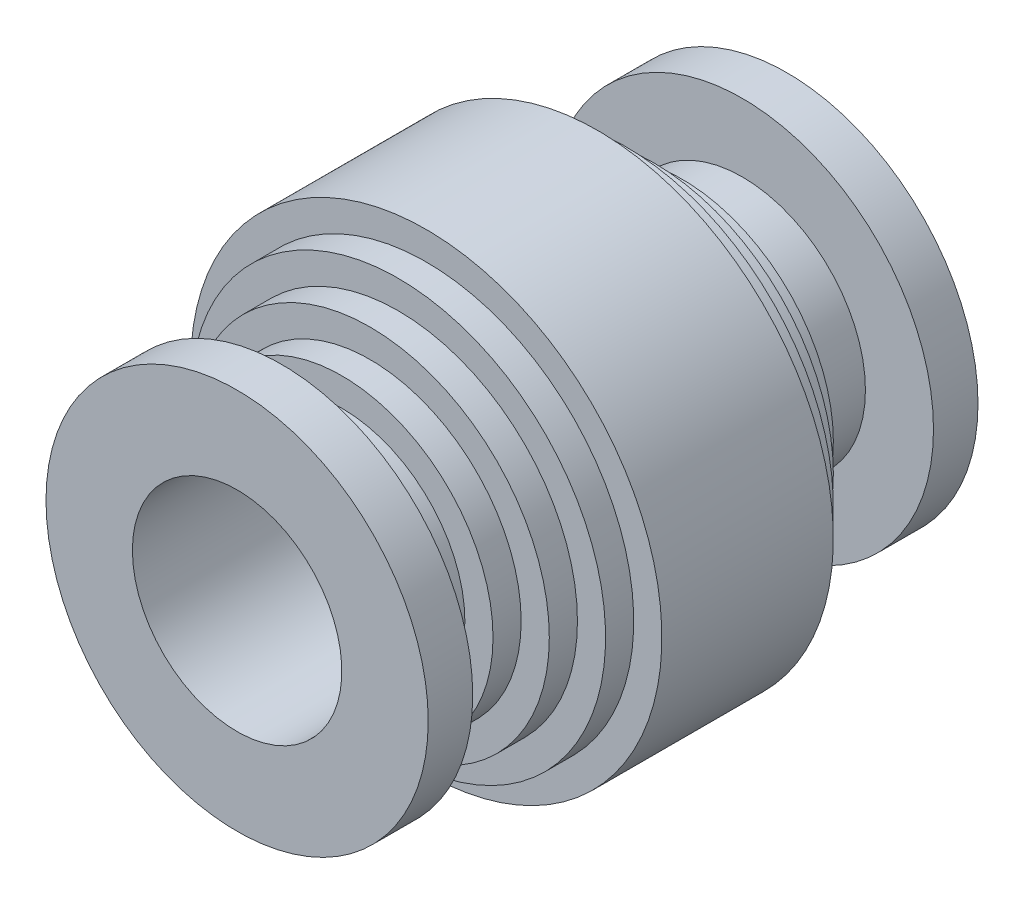
ISO-10303-21;
HEADER;
FILE_DESCRIPTION(('STEP AP214'),'2;1');
FILE_NAME('part.step','',(''),(''),'','','');
FILE_SCHEMA(('AUTOMOTIVE_DESIGN { 1 0 10303 214 1 1 1 1 }'));
ENDSEC;
DATA;
#1=APPLICATION_CONTEXT('core data for automotive mechanical design processes');
#2=APPLICATION_PROTOCOL_DEFINITION('international standard','automotive_design',2000,#1);
#3=PRODUCT_CONTEXT('',#1,'mechanical');
#4=PRODUCT('Part','Part','',(#3));
#5=PRODUCT_RELATED_PRODUCT_CATEGORY('part','',(#4));
#6=PRODUCT_DEFINITION_FORMATION('','',#4);
#7=PRODUCT_DEFINITION_CONTEXT('part definition',#1,'design');
#8=PRODUCT_DEFINITION('design','',#6,#7);
#9=PRODUCT_DEFINITION_SHAPE('','',#8);
#10=(LENGTH_UNIT() NAMED_UNIT(*) SI_UNIT(.MILLI.,.METRE.));
#11=(NAMED_UNIT(*) PLANE_ANGLE_UNIT() SI_UNIT($,.RADIAN.));
#12=(NAMED_UNIT(*) SI_UNIT($,.STERADIAN.) SOLID_ANGLE_UNIT());
#13=UNCERTAINTY_MEASURE_WITH_UNIT(LENGTH_MEASURE(1.E-05),#10,'distance_accuracy_value','');
#14=(GEOMETRIC_REPRESENTATION_CONTEXT(3) GLOBAL_UNCERTAINTY_ASSIGNED_CONTEXT((#13)) GLOBAL_UNIT_ASSIGNED_CONTEXT((#10,
#11,#12)) REPRESENTATION_CONTEXT('',''));
#15=CARTESIAN_POINT('',(0.,0.,0.));
#16=DIRECTION('',(0.,0.,1.));
#17=DIRECTION('',(1.,0.,0.));
#18=AXIS2_PLACEMENT_3D('',#15,#16,#17);
#19=CARTESIAN_POINT('',(0.,0.,-15.));
#20=DIRECTION('',(0.,0.,-1.));
#21=DIRECTION('',(-1.,0.,0.));
#22=AXIS2_PLACEMENT_3D('',#19,#20,#21);
#23=CYLINDRICAL_SURFACE('',#22,4.);
#24=CARTESIAN_POINT('',(0.,0.,0.));
#25=DIRECTION('',(0.,0.,-1.));
#26=DIRECTION('',(-1.,0.,0.));
#27=AXIS2_PLACEMENT_3D('',#24,#25,#26);
#28=CIRCLE('',#27,4.);
#29=CARTESIAN_POINT('',(-4.,0.,0.));
#30=VERTEX_POINT('',#29);
#31=EDGE_CURVE('E10',#30,#30,#28,.T.);
#32=ORIENTED_EDGE('',*,*,#31,.F.);
#33=EDGE_LOOP('',(#32));
#34=FACE_BOUND('',#33,.T.);
#35=CARTESIAN_POINT('',(0.,0.,-21.));
#36=DIRECTION('',(0.,0.,-1.));
#37=DIRECTION('',(-1.,0.,0.));
#38=AXIS2_PLACEMENT_3D('',#35,#36,#37);
#39=CIRCLE('',#38,4.);
#40=CARTESIAN_POINT('',(-4.,0.,-21.));
#41=VERTEX_POINT('',#40);
#42=EDGE_CURVE('E112',#41,#41,#39,.T.);
#43=ORIENTED_EDGE('',*,*,#42,.T.);
#44=EDGE_LOOP('',(#43));
#45=FACE_BOUND('',#44,.T.);
#46=ADVANCED_FACE('F36',(#34,#45),#23,.F.);
#47=CARTESIAN_POINT('',(4.,0.,0.));
#48=DIRECTION('',(0.,0.,-1.));
#49=DIRECTION('',(-1.,0.,0.));
#50=AXIS2_PLACEMENT_3D('',#47,#48,#49);
#51=PLANE('',#50);
#52=CARTESIAN_POINT('',(0.,0.,0.));
#53=DIRECTION('',(0.,0.,-1.));
#54=DIRECTION('',(-1.,0.,0.));
#55=AXIS2_PLACEMENT_3D('',#52,#53,#54);
#56=CIRCLE('',#55,7.3);
#57=CARTESIAN_POINT('',(-7.3,0.,0.));
#58=VERTEX_POINT('',#57);
#59=EDGE_CURVE('E42',#58,#58,#56,.T.);
#60=ORIENTED_EDGE('',*,*,#59,.F.);
#61=EDGE_LOOP('',(#60));
#62=FACE_BOUND('',#61,.T.);
#63=ORIENTED_EDGE('',*,*,#31,.T.);
#64=EDGE_LOOP('',(#63));
#65=FACE_BOUND('',#64,.T.);
#66=ADVANCED_FACE('F245',(#62,#65),#51,.F.);
#67=CARTESIAN_POINT('',(0.,0.,-15.));
#68=DIRECTION('',(0.,0.,-1.));
#69=DIRECTION('',(-1.,0.,0.));
#70=AXIS2_PLACEMENT_3D('',#67,#68,#69);
#71=CYLINDRICAL_SURFACE('',#70,7.3);
#72=CARTESIAN_POINT('',(0.,0.,-1.7));
#73=DIRECTION('',(0.,0.,-1.));
#74=DIRECTION('',(-1.,0.,0.));
#75=AXIS2_PLACEMENT_3D('',#72,#73,#74);
#76=CIRCLE('',#75,7.3);
#77=CARTESIAN_POINT('',(-7.3,0.,-1.7));
#78=VERTEX_POINT('',#77);
#79=EDGE_CURVE('E46',#78,#78,#76,.T.);
#80=ORIENTED_EDGE('',*,*,#79,.F.);
#81=EDGE_LOOP('',(#80));
#82=FACE_BOUND('',#81,.T.);
#83=ORIENTED_EDGE('',*,*,#59,.T.);
#84=EDGE_LOOP('',(#83));
#85=FACE_BOUND('',#84,.T.);
#86=ADVANCED_FACE('F240',(#82,#85),#71,.T.);
#87=CARTESIAN_POINT('',(7.3,0.,-1.7));
#88=DIRECTION('',(0.,0.,1.));
#89=DIRECTION('',(1.,0.,0.));
#90=AXIS2_PLACEMENT_3D('',#87,#88,#89);
#91=PLANE('',#90);
#92=CARTESIAN_POINT('',(0.,0.,-1.7));
#93=DIRECTION('',(0.,0.,-1.));
#94=DIRECTION('',(-1.,0.,0.));
#95=AXIS2_PLACEMENT_3D('',#92,#93,#94);
#96=CIRCLE('',#95,4.7);
#97=CARTESIAN_POINT('',(-4.7,0.,-1.7));
#98=VERTEX_POINT('',#97);
#99=EDGE_CURVE('E50',#98,#98,#96,.T.);
#100=ORIENTED_EDGE('',*,*,#99,.F.);
#101=EDGE_LOOP('',(#100));
#102=FACE_BOUND('',#101,.T.);
#103=ORIENTED_EDGE('',*,*,#79,.T.);
#104=EDGE_LOOP('',(#103));
#105=FACE_BOUND('',#104,.T.);
#106=ADVANCED_FACE('F234',(#102,#105),#91,.F.);
#107=CARTESIAN_POINT('',(0.,0.,-15.));
#108=DIRECTION('',(0.,0.,-1.));
#109=DIRECTION('',(-1.,0.,0.));
#110=AXIS2_PLACEMENT_3D('',#107,#108,#109);
#111=CYLINDRICAL_SURFACE('',#110,4.7);
#112=CARTESIAN_POINT('',(0.,0.,-4.));
#113=DIRECTION('',(0.,0.,-1.));
#114=DIRECTION('',(-1.,0.,0.));
#115=AXIS2_PLACEMENT_3D('',#112,#113,#114);
#116=CIRCLE('',#115,4.7);
#117=CARTESIAN_POINT('',(-4.7,0.,-4.));
#118=VERTEX_POINT('',#117);
#119=EDGE_CURVE('E55',#118,#118,#116,.T.);
#120=ORIENTED_EDGE('',*,*,#119,.F.);
#121=EDGE_LOOP('',(#120));
#122=FACE_BOUND('',#121,.T.);
#123=ORIENTED_EDGE('',*,*,#99,.T.);
#124=EDGE_LOOP('',(#123));
#125=FACE_BOUND('',#124,.T.);
#126=ADVANCED_FACE('F228',(#122,#125),#111,.T.);
#127=CARTESIAN_POINT('',(4.7,0.,-4.));
#128=DIRECTION('',(0.,0.,-1.));
#129=DIRECTION('',(-1.,0.,0.));
#130=AXIS2_PLACEMENT_3D('',#127,#128,#129);
#131=PLANE('',#130);
#132=CARTESIAN_POINT('',(0.,0.,-4.));
#133=DIRECTION('',(0.,0.,-1.));
#134=DIRECTION('',(-1.,0.,0.));
#135=AXIS2_PLACEMENT_3D('',#132,#133,#134);
#136=CIRCLE('',#135,5.775);
#137=CARTESIAN_POINT('',(-5.775,0.,-4.));
#138=VERTEX_POINT('',#137);
#139=EDGE_CURVE('E58',#138,#138,#136,.T.);
#140=ORIENTED_EDGE('',*,*,#139,.F.);
#141=EDGE_LOOP('',(#140));
#142=FACE_BOUND('',#141,.T.);
#143=ORIENTED_EDGE('',*,*,#119,.T.);
#144=EDGE_LOOP('',(#143));
#145=FACE_BOUND('',#144,.T.);
#146=ADVANCED_FACE('F222',(#142,#145),#131,.F.);
#147=CARTESIAN_POINT('',(0.,0.,-15.));
#148=DIRECTION('',(0.,0.,-1.));
#149=DIRECTION('',(-1.,0.,0.));
#150=AXIS2_PLACEMENT_3D('',#147,#148,#149);
#151=CYLINDRICAL_SURFACE('',#150,5.775);
#152=CARTESIAN_POINT('',(0.,0.,-5.075));
#153=DIRECTION('',(0.,0.,-1.));
#154=DIRECTION('',(-1.,0.,0.));
#155=AXIS2_PLACEMENT_3D('',#152,#153,#154);
#156=CIRCLE('',#155,5.775);
#157=CARTESIAN_POINT('',(-5.775,0.,-5.075));
#158=VERTEX_POINT('',#157);
#159=EDGE_CURVE('E61',#158,#158,#156,.T.);
#160=ORIENTED_EDGE('',*,*,#159,.F.);
#161=EDGE_LOOP('',(#160));
#162=FACE_BOUND('',#161,.T.);
#163=ORIENTED_EDGE('',*,*,#139,.T.);
#164=EDGE_LOOP('',(#163));
#165=FACE_BOUND('',#164,.T.);
#166=ADVANCED_FACE('F216',(#162,#165),#151,.T.);
#167=CARTESIAN_POINT('',(5.775,0.,-5.075));
#168=DIRECTION('',(0.,0.,-1.));
#169=DIRECTION('',(-1.,0.,0.));
#170=AXIS2_PLACEMENT_3D('',#167,#168,#169);
#171=PLANE('',#170);
#172=CARTESIAN_POINT('',(0.,0.,-5.075));
#173=DIRECTION('',(0.,0.,-1.));
#174=DIRECTION('',(-1.,0.,0.));
#175=AXIS2_PLACEMENT_3D('',#172,#173,#174);
#176=CIRCLE('',#175,6.85);
#177=CARTESIAN_POINT('',(-6.85,0.,-5.075));
#178=VERTEX_POINT('',#177);
#179=EDGE_CURVE('E64',#178,#178,#176,.T.);
#180=ORIENTED_EDGE('',*,*,#179,.F.);
#181=EDGE_LOOP('',(#180));
#182=FACE_BOUND('',#181,.T.);
#183=ORIENTED_EDGE('',*,*,#159,.T.);
#184=EDGE_LOOP('',(#183));
#185=FACE_BOUND('',#184,.T.);
#186=ADVANCED_FACE('F210',(#182,#185),#171,.F.);
#187=CARTESIAN_POINT('',(0.,0.,-15.));
#188=DIRECTION('',(0.,0.,-1.));
#189=DIRECTION('',(-1.,0.,0.));
#190=AXIS2_PLACEMENT_3D('',#187,#188,#189);
#191=CYLINDRICAL_SURFACE('',#190,6.85);
#192=CARTESIAN_POINT('',(0.,0.,-6.15));
#193=DIRECTION('',(0.,0.,-1.));
#194=DIRECTION('',(-1.,0.,0.));
#195=AXIS2_PLACEMENT_3D('',#192,#193,#194);
#196=CIRCLE('',#195,6.85);
#197=CARTESIAN_POINT('',(-6.85,0.,-6.15));
#198=VERTEX_POINT('',#197);
#199=EDGE_CURVE('E67',#198,#198,#196,.T.);
#200=ORIENTED_EDGE('',*,*,#199,.F.);
#201=EDGE_LOOP('',(#200));
#202=FACE_BOUND('',#201,.T.);
#203=ORIENTED_EDGE('',*,*,#179,.T.);
#204=EDGE_LOOP('',(#203));
#205=FACE_BOUND('',#204,.T.);
#206=ADVANCED_FACE('F204',(#202,#205),#191,.T.);
#207=CARTESIAN_POINT('',(6.85,0.,-6.15));
#208=DIRECTION('',(0.,0.,-1.));
#209=DIRECTION('',(-1.,0.,0.));
#210=AXIS2_PLACEMENT_3D('',#207,#208,#209);
#211=PLANE('',#210);
#212=CARTESIAN_POINT('',(0.,0.,-6.15));
#213=DIRECTION('',(0.,0.,-1.));
#214=DIRECTION('',(-1.,0.,0.));
#215=AXIS2_PLACEMENT_3D('',#212,#213,#214);
#216=CIRCLE('',#215,7.925);
#217=CARTESIAN_POINT('',(-7.925,0.,-6.15));
#218=VERTEX_POINT('',#217);
#219=EDGE_CURVE('E70',#218,#218,#216,.T.);
#220=ORIENTED_EDGE('',*,*,#219,.F.);
#221=EDGE_LOOP('',(#220));
#222=FACE_BOUND('',#221,.T.);
#223=ORIENTED_EDGE('',*,*,#199,.T.);
#224=EDGE_LOOP('',(#223));
#225=FACE_BOUND('',#224,.T.);
#226=ADVANCED_FACE('F198',(#222,#225),#211,.F.);
#227=CARTESIAN_POINT('',(0.,0.,-15.));
#228=DIRECTION('',(0.,0.,-1.));
#229=DIRECTION('',(-1.,0.,0.));
#230=AXIS2_PLACEMENT_3D('',#227,#228,#229);
#231=CYLINDRICAL_SURFACE('',#230,7.925);
#232=CARTESIAN_POINT('',(0.,0.,-7.225));
#233=DIRECTION('',(0.,0.,-1.));
#234=DIRECTION('',(-1.,0.,0.));
#235=AXIS2_PLACEMENT_3D('',#232,#233,#234);
#236=CIRCLE('',#235,7.925);
#237=CARTESIAN_POINT('',(-7.925,0.,-7.225));
#238=VERTEX_POINT('',#237);
#239=EDGE_CURVE('E73',#238,#238,#236,.T.);
#240=ORIENTED_EDGE('',*,*,#239,.F.);
#241=EDGE_LOOP('',(#240));
#242=FACE_BOUND('',#241,.T.);
#243=ORIENTED_EDGE('',*,*,#219,.T.);
#244=EDGE_LOOP('',(#243));
#245=FACE_BOUND('',#244,.T.);
#246=ADVANCED_FACE('F192',(#242,#245),#231,.T.);
#247=CARTESIAN_POINT('',(7.925,0.,-7.225));
#248=DIRECTION('',(0.,0.,-1.));
#249=DIRECTION('',(-1.,0.,0.));
#250=AXIS2_PLACEMENT_3D('',#247,#248,#249);
#251=PLANE('',#250);
#252=CARTESIAN_POINT('',(0.,0.,-7.225));
#253=DIRECTION('',(0.,0.,-1.));
#254=DIRECTION('',(-1.,0.,0.));
#255=AXIS2_PLACEMENT_3D('',#252,#253,#254);
#256=CIRCLE('',#255,9.);
#257=CARTESIAN_POINT('',(-9.,0.,-7.225));
#258=VERTEX_POINT('',#257);
#259=EDGE_CURVE('E76',#258,#258,#256,.T.);
#260=ORIENTED_EDGE('',*,*,#259,.F.);
#261=EDGE_LOOP('',(#260));
#262=FACE_BOUND('',#261,.T.);
#263=ORIENTED_EDGE('',*,*,#239,.T.);
#264=EDGE_LOOP('',(#263));
#265=FACE_BOUND('',#264,.T.);
#266=ADVANCED_FACE('F186',(#262,#265),#251,.F.);
#267=CARTESIAN_POINT('',(0.,0.,-15.));
#268=DIRECTION('',(0.,0.,-1.));
#269=DIRECTION('',(-1.,0.,0.));
#270=AXIS2_PLACEMENT_3D('',#267,#268,#269);
#271=CYLINDRICAL_SURFACE('',#270,9.);
#272=CARTESIAN_POINT('',(0.,0.,-13.775));
#273=DIRECTION('',(0.,0.,-1.));
#274=DIRECTION('',(-1.,0.,0.));
#275=AXIS2_PLACEMENT_3D('',#272,#273,#274);
#276=CIRCLE('',#275,9.);
#277=CARTESIAN_POINT('',(-9.,0.,-13.775));
#278=VERTEX_POINT('',#277);
#279=EDGE_CURVE('E79',#278,#278,#276,.T.);
#280=ORIENTED_EDGE('',*,*,#279,.F.);
#281=EDGE_LOOP('',(#280));
#282=FACE_BOUND('',#281,.T.);
#283=ORIENTED_EDGE('',*,*,#259,.T.);
#284=EDGE_LOOP('',(#283));
#285=FACE_BOUND('',#284,.T.);
#286=ADVANCED_FACE('F180',(#282,#285),#271,.T.);
#287=CARTESIAN_POINT('',(7.925,0.,-13.775));
#288=DIRECTION('',(0.,0.,1.));
#289=DIRECTION('',(1.,0.,0.));
#290=AXIS2_PLACEMENT_3D('',#287,#288,#289);
#291=PLANE('',#290);
#292=CARTESIAN_POINT('',(0.,0.,-13.775));
#293=DIRECTION('',(0.,0.,-1.));
#294=DIRECTION('',(-1.,0.,0.));
#295=AXIS2_PLACEMENT_3D('',#292,#293,#294);
#296=CIRCLE('',#295,7.925);
#297=CARTESIAN_POINT('',(-7.925,0.,-13.775));
#298=VERTEX_POINT('',#297);
#299=EDGE_CURVE('E82',#298,#298,#296,.T.);
#300=ORIENTED_EDGE('',*,*,#299,.F.);
#301=EDGE_LOOP('',(#300));
#302=FACE_BOUND('',#301,.T.);
#303=ORIENTED_EDGE('',*,*,#279,.T.);
#304=EDGE_LOOP('',(#303));
#305=FACE_BOUND('',#304,.T.);
#306=ADVANCED_FACE('F174',(#302,#305),#291,.F.);
#307=CARTESIAN_POINT('',(0.,0.,-15.));
#308=DIRECTION('',(0.,0.,-1.));
#309=DIRECTION('',(-1.,0.,0.));
#310=AXIS2_PLACEMENT_3D('',#307,#308,#309);
#311=CYLINDRICAL_SURFACE('',#310,7.925);
#312=CARTESIAN_POINT('',(0.,0.,-14.85));
#313=DIRECTION('',(0.,0.,-1.));
#314=DIRECTION('',(-1.,0.,0.));
#315=AXIS2_PLACEMENT_3D('',#312,#313,#314);
#316=CIRCLE('',#315,7.925);
#317=CARTESIAN_POINT('',(-7.925,0.,-14.85));
#318=VERTEX_POINT('',#317);
#319=EDGE_CURVE('E85',#318,#318,#316,.T.);
#320=ORIENTED_EDGE('',*,*,#319,.F.);
#321=EDGE_LOOP('',(#320));
#322=FACE_BOUND('',#321,.T.);
#323=ORIENTED_EDGE('',*,*,#299,.T.);
#324=EDGE_LOOP('',(#323));
#325=FACE_BOUND('',#324,.T.);
#326=ADVANCED_FACE('F168',(#322,#325),#311,.T.);
#327=CARTESIAN_POINT('',(6.85,0.,-14.85));
#328=DIRECTION('',(0.,0.,1.));
#329=DIRECTION('',(1.,0.,0.));
#330=AXIS2_PLACEMENT_3D('',#327,#328,#329);
#331=PLANE('',#330);
#332=CARTESIAN_POINT('',(0.,0.,-14.85));
#333=DIRECTION('',(0.,0.,-1.));
#334=DIRECTION('',(-1.,0.,0.));
#335=AXIS2_PLACEMENT_3D('',#332,#333,#334);
#336=CIRCLE('',#335,6.85);
#337=CARTESIAN_POINT('',(-6.85,0.,-14.85));
#338=VERTEX_POINT('',#337);
#339=EDGE_CURVE('E88',#338,#338,#336,.T.);
#340=ORIENTED_EDGE('',*,*,#339,.F.);
#341=EDGE_LOOP('',(#340));
#342=FACE_BOUND('',#341,.T.);
#343=ORIENTED_EDGE('',*,*,#319,.T.);
#344=EDGE_LOOP('',(#343));
#345=FACE_BOUND('',#344,.T.);
#346=ADVANCED_FACE('F162',(#342,#345),#331,.F.);
#347=CARTESIAN_POINT('',(0.,0.,-15.));
#348=DIRECTION('',(0.,0.,-1.));
#349=DIRECTION('',(-1.,0.,0.));
#350=AXIS2_PLACEMENT_3D('',#347,#348,#349);
#351=CYLINDRICAL_SURFACE('',#350,6.85);
#352=CARTESIAN_POINT('',(0.,0.,-15.925));
#353=DIRECTION('',(0.,0.,-1.));
#354=DIRECTION('',(-1.,0.,0.));
#355=AXIS2_PLACEMENT_3D('',#352,#353,#354);
#356=CIRCLE('',#355,6.85);
#357=CARTESIAN_POINT('',(-6.85,0.,-15.925));
#358=VERTEX_POINT('',#357);
#359=EDGE_CURVE('E91',#358,#358,#356,.T.);
#360=ORIENTED_EDGE('',*,*,#359,.F.);
#361=EDGE_LOOP('',(#360));
#362=FACE_BOUND('',#361,.T.);
#363=ORIENTED_EDGE('',*,*,#339,.T.);
#364=EDGE_LOOP('',(#363));
#365=FACE_BOUND('',#364,.T.);
#366=ADVANCED_FACE('F156',(#362,#365),#351,.T.);
#367=CARTESIAN_POINT('',(5.775,0.,-15.925));
#368=DIRECTION('',(0.,0.,1.));
#369=DIRECTION('',(1.,0.,0.));
#370=AXIS2_PLACEMENT_3D('',#367,#368,#369);
#371=PLANE('',#370);
#372=CARTESIAN_POINT('',(0.,0.,-15.925));
#373=DIRECTION('',(0.,0.,-1.));
#374=DIRECTION('',(-1.,0.,0.));
#375=AXIS2_PLACEMENT_3D('',#372,#373,#374);
#376=CIRCLE('',#375,5.775);
#377=CARTESIAN_POINT('',(-5.775,0.,-15.925));
#378=VERTEX_POINT('',#377);
#379=EDGE_CURVE('E94',#378,#378,#376,.T.);
#380=ORIENTED_EDGE('',*,*,#379,.F.);
#381=EDGE_LOOP('',(#380));
#382=FACE_BOUND('',#381,.T.);
#383=ORIENTED_EDGE('',*,*,#359,.T.);
#384=EDGE_LOOP('',(#383));
#385=FACE_BOUND('',#384,.T.);
#386=ADVANCED_FACE('F150',(#382,#385),#371,.F.);
#387=CARTESIAN_POINT('',(0.,0.,-15.));
#388=DIRECTION('',(0.,0.,-1.));
#389=DIRECTION('',(-1.,0.,0.));
#390=AXIS2_PLACEMENT_3D('',#387,#388,#389);
#391=CYLINDRICAL_SURFACE('',#390,5.775);
#392=CARTESIAN_POINT('',(0.,0.,-17.));
#393=DIRECTION('',(0.,0.,-1.));
#394=DIRECTION('',(-1.,0.,0.));
#395=AXIS2_PLACEMENT_3D('',#392,#393,#394);
#396=CIRCLE('',#395,5.775);
#397=CARTESIAN_POINT('',(-5.775,0.,-17.));
#398=VERTEX_POINT('',#397);
#399=EDGE_CURVE('E97',#398,#398,#396,.T.);
#400=ORIENTED_EDGE('',*,*,#399,.F.);
#401=EDGE_LOOP('',(#400));
#402=FACE_BOUND('',#401,.T.);
#403=ORIENTED_EDGE('',*,*,#379,.T.);
#404=EDGE_LOOP('',(#403));
#405=FACE_BOUND('',#404,.T.);
#406=ADVANCED_FACE('F144',(#402,#405),#391,.T.);
#407=CARTESIAN_POINT('',(4.7,0.,-17.));
#408=DIRECTION('',(0.,0.,1.));
#409=DIRECTION('',(1.,0.,0.));
#410=AXIS2_PLACEMENT_3D('',#407,#408,#409);
#411=PLANE('',#410);
#412=CARTESIAN_POINT('',(0.,0.,-17.));
#413=DIRECTION('',(0.,0.,-1.));
#414=DIRECTION('',(-1.,0.,0.));
#415=AXIS2_PLACEMENT_3D('',#412,#413,#414);
#416=CIRCLE('',#415,4.7);
#417=CARTESIAN_POINT('',(-4.7,0.,-17.));
#418=VERTEX_POINT('',#417);
#419=EDGE_CURVE('E100',#418,#418,#416,.T.);
#420=ORIENTED_EDGE('',*,*,#419,.F.);
#421=EDGE_LOOP('',(#420));
#422=FACE_BOUND('',#421,.T.);
#423=ORIENTED_EDGE('',*,*,#399,.T.);
#424=EDGE_LOOP('',(#423));
#425=FACE_BOUND('',#424,.T.);
#426=ADVANCED_FACE('F138',(#422,#425),#411,.F.);
#427=CARTESIAN_POINT('',(0.,0.,-15.));
#428=DIRECTION('',(0.,0.,-1.));
#429=DIRECTION('',(-1.,0.,0.));
#430=AXIS2_PLACEMENT_3D('',#427,#428,#429);
#431=CYLINDRICAL_SURFACE('',#430,4.7);
#432=CARTESIAN_POINT('',(0.,0.,-19.3));
#433=DIRECTION('',(0.,0.,-1.));
#434=DIRECTION('',(-1.,0.,0.));
#435=AXIS2_PLACEMENT_3D('',#432,#433,#434);
#436=CIRCLE('',#435,4.7);
#437=CARTESIAN_POINT('',(-4.7,0.,-19.3));
#438=VERTEX_POINT('',#437);
#439=EDGE_CURVE('E103',#438,#438,#436,.T.);
#440=ORIENTED_EDGE('',*,*,#439,.F.);
#441=EDGE_LOOP('',(#440));
#442=FACE_BOUND('',#441,.T.);
#443=ORIENTED_EDGE('',*,*,#419,.T.);
#444=EDGE_LOOP('',(#443));
#445=FACE_BOUND('',#444,.T.);
#446=ADVANCED_FACE('F132',(#442,#445),#431,.T.);
#447=CARTESIAN_POINT('',(7.3,0.,-19.3));
#448=DIRECTION('',(0.,0.,-1.));
#449=DIRECTION('',(-1.,0.,0.));
#450=AXIS2_PLACEMENT_3D('',#447,#448,#449);
#451=PLANE('',#450);
#452=CARTESIAN_POINT('',(0.,0.,-19.3));
#453=DIRECTION('',(0.,0.,-1.));
#454=DIRECTION('',(-1.,0.,0.));
#455=AXIS2_PLACEMENT_3D('',#452,#453,#454);
#456=CIRCLE('',#455,7.3);
#457=CARTESIAN_POINT('',(-7.3,0.,-19.3));
#458=VERTEX_POINT('',#457);
#459=EDGE_CURVE('E106',#458,#458,#456,.T.);
#460=ORIENTED_EDGE('',*,*,#459,.F.);
#461=EDGE_LOOP('',(#460));
#462=FACE_BOUND('',#461,.T.);
#463=ORIENTED_EDGE('',*,*,#439,.T.);
#464=EDGE_LOOP('',(#463));
#465=FACE_BOUND('',#464,.T.);
#466=ADVANCED_FACE('F126',(#462,#465),#451,.F.);
#467=CARTESIAN_POINT('',(0.,0.,-15.));
#468=DIRECTION('',(0.,0.,-1.));
#469=DIRECTION('',(-1.,0.,0.));
#470=AXIS2_PLACEMENT_3D('',#467,#468,#469);
#471=CYLINDRICAL_SURFACE('',#470,7.3);
#472=CARTESIAN_POINT('',(0.,0.,-21.));
#473=DIRECTION('',(0.,0.,-1.));
#474=DIRECTION('',(-1.,0.,0.));
#475=AXIS2_PLACEMENT_3D('',#472,#473,#474);
#476=CIRCLE('',#475,7.3);
#477=CARTESIAN_POINT('',(-7.3,0.,-21.));
#478=VERTEX_POINT('',#477);
#479=EDGE_CURVE('E109',#478,#478,#476,.T.);
#480=ORIENTED_EDGE('',*,*,#479,.F.);
#481=EDGE_LOOP('',(#480));
#482=FACE_BOUND('',#481,.T.);
#483=ORIENTED_EDGE('',*,*,#459,.T.);
#484=EDGE_LOOP('',(#483));
#485=FACE_BOUND('',#484,.T.);
#486=ADVANCED_FACE('F120',(#482,#485),#471,.T.);
#487=CARTESIAN_POINT('',(7.3,0.,-21.));
#488=DIRECTION('',(0.,0.,1.));
#489=DIRECTION('',(1.,0.,0.));
#490=AXIS2_PLACEMENT_3D('',#487,#488,#489);
#491=PLANE('',#490);
#492=ORIENTED_EDGE('',*,*,#42,.F.);
#493=EDGE_LOOP('',(#492));
#494=FACE_BOUND('',#493,.T.);
#495=ORIENTED_EDGE('',*,*,#479,.T.);
#496=EDGE_LOOP('',(#495));
#497=FACE_BOUND('',#496,.T.);
#498=ADVANCED_FACE('F117',(#494,#497),#491,.F.);
#499=CLOSED_SHELL('',(#46,#66,#86,#106,#126,#146,#166,#186,#206,#226,#246,#266,#286,#306,#326,
#346,#366,#386,#406,#426,#446,#466,#486,#498));
#500=MANIFOLD_SOLID_BREP('B2',#499);
#501=ADVANCED_BREP_SHAPE_REPRESENTATION('',(#18,#500),#14);
#502=SHAPE_DEFINITION_REPRESENTATION(#9,#501);
ENDSEC;
END-ISO-10303-21;
